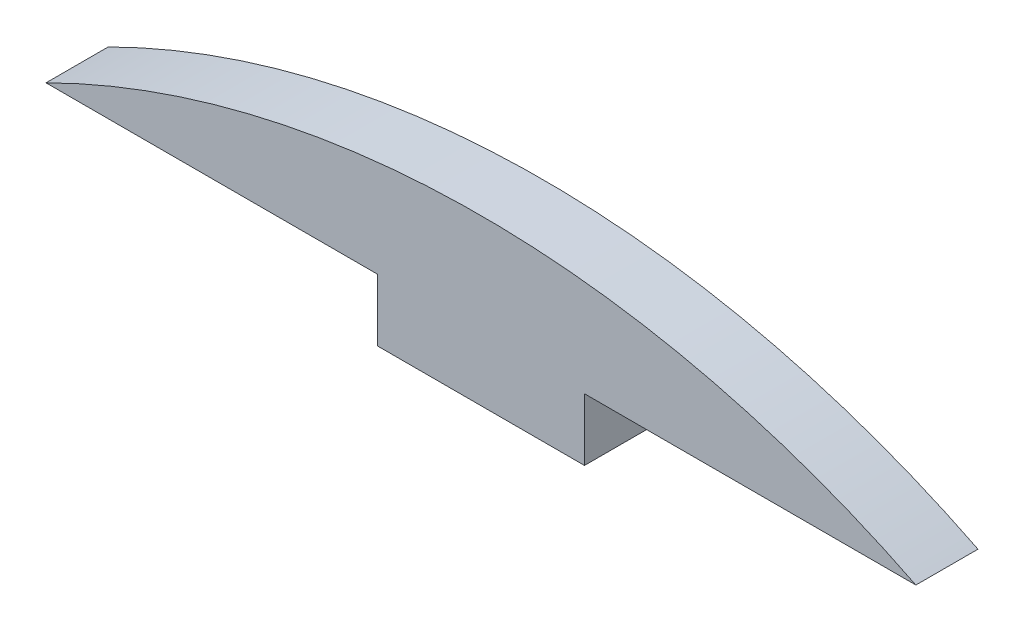
ISO-10303-21;
HEADER;
FILE_DESCRIPTION(('STEP AP214'),'2;1');
FILE_NAME('part.step','',(''),(''),'','','');
FILE_SCHEMA(('AUTOMOTIVE_DESIGN { 1 0 10303 214 1 1 1 1 }'));
ENDSEC;
DATA;
#1=APPLICATION_CONTEXT('core data for automotive mechanical design processes');
#2=APPLICATION_PROTOCOL_DEFINITION('international standard','automotive_design',2000,#1);
#3=PRODUCT_CONTEXT('',#1,'mechanical');
#4=PRODUCT('Part','Part','',(#3));
#5=PRODUCT_RELATED_PRODUCT_CATEGORY('part','',(#4));
#6=PRODUCT_DEFINITION_FORMATION('','',#4);
#7=PRODUCT_DEFINITION_CONTEXT('part definition',#1,'design');
#8=PRODUCT_DEFINITION('design','',#6,#7);
#9=PRODUCT_DEFINITION_SHAPE('','',#8);
#10=(LENGTH_UNIT() NAMED_UNIT(*) SI_UNIT(.MILLI.,.METRE.));
#11=(NAMED_UNIT(*) PLANE_ANGLE_UNIT() SI_UNIT($,.RADIAN.));
#12=(NAMED_UNIT(*) SI_UNIT($,.STERADIAN.) SOLID_ANGLE_UNIT());
#13=UNCERTAINTY_MEASURE_WITH_UNIT(LENGTH_MEASURE(1.E-05),#10,'distance_accuracy_value','');
#14=(GEOMETRIC_REPRESENTATION_CONTEXT(3) GLOBAL_UNCERTAINTY_ASSIGNED_CONTEXT((#13)) GLOBAL_UNIT_ASSIGNED_CONTEXT((#10,
#11,#12)) REPRESENTATION_CONTEXT('',''));
#15=CARTESIAN_POINT('',(0.,0.,0.));
#16=DIRECTION('',(0.,0.,1.));
#17=DIRECTION('',(1.,0.,0.));
#18=AXIS2_PLACEMENT_3D('',#15,#16,#17);
#19=CARTESIAN_POINT('',(-21.2519999902,39.047592085,2.9999999944));
#20=DIRECTION('',(0.,0.,1.));
#21=DIRECTION('',(1.,0.,0.));
#22=AXIS2_PLACEMENT_3D('',#19,#20,#21);
#23=PLANE('',#22);
#24=DIRECTION('',(-1.,0.,0.));
#25=VECTOR('',#24,1.);
#26=CARTESIAN_POINT('',(-13.0000000096,42.0475920794,2.9999999944));
#27=LINE('',#26,#25);
#28=CARTESIAN_POINT('',(-5.0000000076,42.0475920794,2.9999999944));
#29=VERTEX_POINT('',#28);
#30=CARTESIAN_POINT('',(-21.0000000157045,42.0475920794,2.9999999944));
#31=VERTEX_POINT('',#30);
#32=EDGE_CURVE('E75',#29,#31,#27,.T.);
#33=ORIENTED_EDGE('',*,*,#32,.F.);
#34=DIRECTION('',(0.,1.,0.));
#35=VECTOR('',#34,1.);
#36=CARTESIAN_POINT('',(-5.0000000076,40.5475920822,2.9999999944));
#37=LINE('',#36,#35);
#38=CARTESIAN_POINT('',(-5.0000000076,39.047592085,2.9999999944));
#39=VERTEX_POINT('',#38);
#40=EDGE_CURVE('E98',#39,#29,#37,.T.);
#41=ORIENTED_EDGE('',*,*,#40,.F.);
#42=DIRECTION('',(-1.,0.,0.));
#43=VECTOR('',#42,1.);
#44=CARTESIAN_POINT('',(0.,39.047592085,2.9999999944));
#45=LINE('',#44,#43);
#46=CARTESIAN_POINT('',(5.0000000076,39.047592085,2.9999999944));
#47=VERTEX_POINT('',#46);
#48=EDGE_CURVE('E92',#47,#39,#45,.T.);
#49=ORIENTED_EDGE('',*,*,#48,.F.);
#50=DIRECTION('',(0.,-1.,0.));
#51=VECTOR('',#50,1.);
#52=CARTESIAN_POINT('',(5.0000000076,40.5475920822,2.9999999944));
#53=LINE('',#52,#51);
#54=CARTESIAN_POINT('',(5.0000000076,42.0475920794,2.9999999944));
#55=VERTEX_POINT('',#54);
#56=EDGE_CURVE('E82',#55,#47,#53,.T.);
#57=ORIENTED_EDGE('',*,*,#56,.F.);
#58=DIRECTION('',(-1.,0.,0.));
#59=VECTOR('',#58,1.);
#60=CARTESIAN_POINT('',(13.0000000096,42.0475920794,2.9999999944));
#61=LINE('',#60,#59);
#62=CARTESIAN_POINT('',(21.0000000157045,42.0475920794,2.9999999944));
#63=VERTEX_POINT('',#62);
#64=EDGE_CURVE('E77',#63,#55,#61,.T.);
#65=ORIENTED_EDGE('',*,*,#64,.F.);
#66=CARTESIAN_POINT('',(0.,0.,2.9999999944));
#67=DIRECTION('',(0.,0.,1.));
#68=DIRECTION('',(1.,0.,0.));
#69=AXIS2_PLACEMENT_3D('',#66,#67,#68);
#70=CIRCLE('',#69,47.0000000054);
#71=EDGE_CURVE('E20',#63,#31,#70,.T.);
#72=ORIENTED_EDGE('',*,*,#71,.T.);
#73=EDGE_LOOP('',(#33,#41,#49,#57,#65,#72));
#74=FACE_BOUND('',#73,.T.);
#75=ADVANCED_FACE('F16',(#74),#23,.T.);
#76=CARTESIAN_POINT('',(0.,0.,0.));
#77=DIRECTION('',(0.,0.,1.));
#78=DIRECTION('',(1.,0.,0.));
#79=AXIS2_PLACEMENT_3D('',#76,#77,#78);
#80=CYLINDRICAL_SURFACE('',#79,47.0000000054);
#81=DIRECTION('',(0.,0.,-1.));
#82=VECTOR('',#81,1.);
#83=CARTESIAN_POINT('',(-21.0000000116,42.0475920794,1.4999999972));
#84=LINE('',#83,#82);
#85=CARTESIAN_POINT('',(-21.0000000161318,42.0475920791866,0.));
#86=VERTEX_POINT('',#85);
#87=EDGE_CURVE('E71',#31,#86,#84,.T.);
#88=ORIENTED_EDGE('',*,*,#87,.F.);
#89=ORIENTED_EDGE('',*,*,#71,.F.);
#90=DIRECTION('',(0.,0.,1.));
#91=VECTOR('',#90,1.);
#92=CARTESIAN_POINT('',(21.0000000116,42.0475920794,1.4999999972));
#93=LINE('',#92,#91);
#94=CARTESIAN_POINT('',(21.0000000161318,42.0475920791866,0.));
#95=VERTEX_POINT('',#94);
#96=EDGE_CURVE('E70',#95,#63,#93,.T.);
#97=ORIENTED_EDGE('',*,*,#96,.F.);
#98=CARTESIAN_POINT('',(0.,0.,0.));
#99=DIRECTION('',(0.,0.,1.));
#100=DIRECTION('',(1.,0.,0.));
#101=AXIS2_PLACEMENT_3D('',#98,#99,#100);
#102=CIRCLE('',#101,47.0000000054);
#103=EDGE_CURVE('E84',#95,#86,#102,.T.);
#104=ORIENTED_EDGE('',*,*,#103,.T.);
#105=EDGE_LOOP('',(#88,#89,#97,#104));
#106=FACE_BOUND('',#105,.T.);
#107=ADVANCED_FACE('F68',(#106),#80,.T.);
#108=CARTESIAN_POINT('',(-21.0000000116,42.0475920794,0.));
#109=DIRECTION('',(0.,-1.,0.));
#110=DIRECTION('',(1.,0.,0.));
#111=AXIS2_PLACEMENT_3D('',#108,#109,#110);
#112=PLANE('',#111);
#113=ORIENTED_EDGE('',*,*,#32,.T.);
#114=ORIENTED_EDGE('',*,*,#87,.T.);
#115=DIRECTION('',(1.,0.,0.));
#116=VECTOR('',#115,1.);
#117=CARTESIAN_POINT('',(0.,42.0475920789732,0.));
#118=LINE('',#117,#116);
#119=CARTESIAN_POINT('',(-4.99999999529489,42.0475920791155,0.));
#120=VERTEX_POINT('',#119);
#121=EDGE_CURVE('E105',#86,#120,#118,.T.);
#122=ORIENTED_EDGE('',*,*,#121,.T.);
#123=DIRECTION('',(0.,0.,-1.));
#124=VECTOR('',#123,1.);
#125=CARTESIAN_POINT('',(-5.0000000076,42.0475920794,1.4999999972));
#126=LINE('',#125,#124);
#127=EDGE_CURVE('E95',#29,#120,#126,.T.);
#128=ORIENTED_EDGE('',*,*,#127,.F.);
#129=EDGE_LOOP('',(#113,#114,#122,#128));
#130=FACE_BOUND('',#129,.T.);
#131=ADVANCED_FACE('F154',(#130),#112,.T.);
#132=CARTESIAN_POINT('',(-5.0000000076,42.0475920794,0.));
#133=DIRECTION('',(-1.,0.,0.));
#134=DIRECTION('',(0.,-1.,0.));
#135=AXIS2_PLACEMENT_3D('',#132,#133,#134);
#136=PLANE('',#135);
#137=ORIENTED_EDGE('',*,*,#40,.T.);
#138=ORIENTED_EDGE('',*,*,#127,.T.);
#139=DIRECTION('',(0.,-1.,0.));
#140=VECTOR('',#139,1.);
#141=CARTESIAN_POINT('',(-4.99999998914233,43.0476532619,0.));
#142=LINE('',#141,#140);
#143=CARTESIAN_POINT('',(-4.99999999529489,39.047592085,0.));
#144=VERTEX_POINT('',#143);
#145=EDGE_CURVE('E107',#120,#144,#142,.T.);
#146=ORIENTED_EDGE('',*,*,#145,.T.);
#147=DIRECTION('',(0.,0.,-1.));
#148=VECTOR('',#147,1.);
#149=CARTESIAN_POINT('',(-5.0000000076,39.047592085,1.4999999972));
#150=LINE('',#149,#148);
#151=EDGE_CURVE('E94',#39,#144,#150,.T.);
#152=ORIENTED_EDGE('',*,*,#151,.F.);
#153=EDGE_LOOP('',(#137,#138,#146,#152));
#154=FACE_BOUND('',#153,.T.);
#155=ADVANCED_FACE('F153',(#154),#136,.T.);
#156=CARTESIAN_POINT('',(-5.0000000076,39.047592085,2.9999999944));
#157=DIRECTION('',(0.,-1.,0.));
#158=DIRECTION('',(0.,0.,-1.));
#159=AXIS2_PLACEMENT_3D('',#156,#157,#158);
#160=PLANE('',#159);
#161=ORIENTED_EDGE('',*,*,#48,.T.);
#162=ORIENTED_EDGE('',*,*,#151,.T.);
#163=DIRECTION('',(1.,0.,0.));
#164=VECTOR('',#163,1.);
#165=CARTESIAN_POINT('',(0.,39.047592085,0.));
#166=LINE('',#165,#164);
#167=CARTESIAN_POINT('',(4.99999999529489,39.047592085,0.));
#168=VERTEX_POINT('',#167);
#169=EDGE_CURVE('E113',#144,#168,#166,.T.);
#170=ORIENTED_EDGE('',*,*,#169,.T.);
#171=DIRECTION('',(0.,0.,-1.));
#172=VECTOR('',#171,1.);
#173=CARTESIAN_POINT('',(5.0000000076,39.047592085,1.4999999972));
#174=LINE('',#173,#172);
#175=EDGE_CURVE('E79',#47,#168,#174,.T.);
#176=ORIENTED_EDGE('',*,*,#175,.F.);
#177=EDGE_LOOP('',(#161,#162,#170,#176));
#178=FACE_BOUND('',#177,.T.);
#179=ADVANCED_FACE('F148',(#178),#160,.T.);
#180=CARTESIAN_POINT('',(5.0000000076,39.047592085,0.));
#181=DIRECTION('',(1.,0.,0.));
#182=DIRECTION('',(0.,1.,0.));
#183=AXIS2_PLACEMENT_3D('',#180,#181,#182);
#184=PLANE('',#183);
#185=ORIENTED_EDGE('',*,*,#56,.T.);
#186=ORIENTED_EDGE('',*,*,#175,.T.);
#187=DIRECTION('',(0.,1.,0.));
#188=VECTOR('',#187,1.);
#189=CARTESIAN_POINT('',(4.99999998914234,43.0476532619,0.));
#190=LINE('',#189,#188);
#191=CARTESIAN_POINT('',(4.99999999529489,42.0475920791155,0.));
#192=VERTEX_POINT('',#191);
#193=EDGE_CURVE('E26',#168,#192,#190,.T.);
#194=ORIENTED_EDGE('',*,*,#193,.T.);
#195=DIRECTION('',(0.,0.,-1.));
#196=VECTOR('',#195,1.);
#197=CARTESIAN_POINT('',(5.0000000076,42.0475920794,1.4999999972));
#198=LINE('',#197,#196);
#199=EDGE_CURVE('E34',#55,#192,#198,.T.);
#200=ORIENTED_EDGE('',*,*,#199,.F.);
#201=EDGE_LOOP('',(#185,#186,#194,#200));
#202=FACE_BOUND('',#201,.T.);
#203=ADVANCED_FACE('F142',(#202),#184,.T.);
#204=CARTESIAN_POINT('',(5.0000000076,42.0475920794,0.));
#205=DIRECTION('',(0.,-1.,0.));
#206=DIRECTION('',(1.,0.,0.));
#207=AXIS2_PLACEMENT_3D('',#204,#205,#206);
#208=PLANE('',#207);
#209=ORIENTED_EDGE('',*,*,#64,.T.);
#210=ORIENTED_EDGE('',*,*,#199,.T.);
#211=DIRECTION('',(1.,0.,0.));
#212=VECTOR('',#211,1.);
#213=CARTESIAN_POINT('',(0.,42.0475920789732,0.));
#214=LINE('',#213,#212);
#215=EDGE_CURVE('E11',#192,#95,#214,.T.);
#216=ORIENTED_EDGE('',*,*,#215,.T.);
#217=ORIENTED_EDGE('',*,*,#96,.T.);
#218=EDGE_LOOP('',(#209,#210,#216,#217));
#219=FACE_BOUND('',#218,.T.);
#220=ADVANCED_FACE('F76',(#219),#208,.T.);
#221=CARTESIAN_POINT('',(-21.2519999902,39.047592085,0.));
#222=DIRECTION('',(0.,0.,1.));
#223=DIRECTION('',(1.,0.,0.));
#224=AXIS2_PLACEMENT_3D('',#221,#222,#223);
#225=PLANE('',#224);
#226=ORIENTED_EDGE('',*,*,#193,.F.);
#227=ORIENTED_EDGE('',*,*,#169,.F.);
#228=ORIENTED_EDGE('',*,*,#145,.F.);
#229=ORIENTED_EDGE('',*,*,#121,.F.);
#230=ORIENTED_EDGE('',*,*,#103,.F.);
#231=ORIENTED_EDGE('',*,*,#215,.F.);
#232=EDGE_LOOP('',(#226,#227,#228,#229,#230,#231));
#233=FACE_BOUND('',#232,.T.);
#234=ADVANCED_FACE('F18',(#233),#225,.F.);
#235=CLOSED_SHELL('',(#75,#107,#131,#155,#179,#203,#220,#234));
#236=MANIFOLD_SOLID_BREP('B1',#235);
#237=ADVANCED_BREP_SHAPE_REPRESENTATION('',(#18,#236),#14);
#238=SHAPE_DEFINITION_REPRESENTATION(#9,#237);
ENDSEC;
END-ISO-10303-21;
